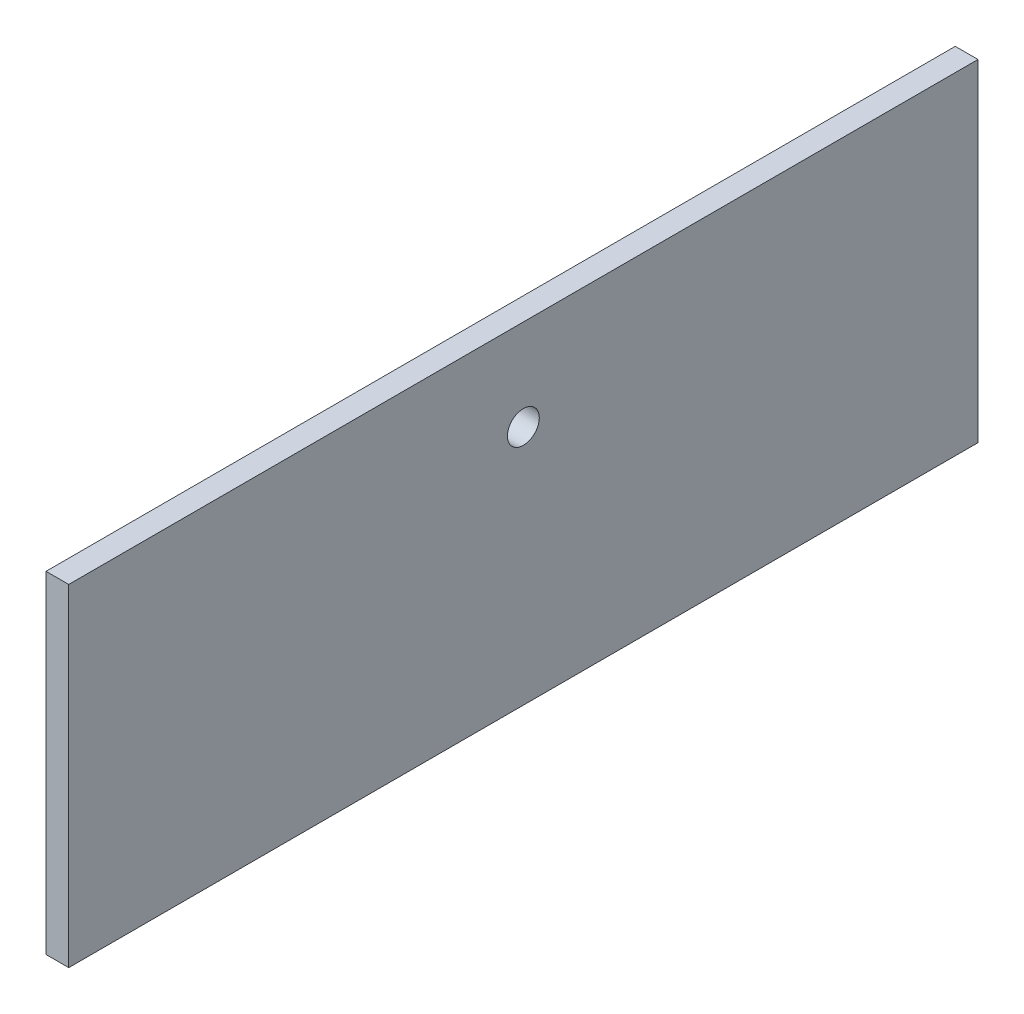
ISO-10303-21;
HEADER;
FILE_DESCRIPTION(('STEP AP214'),'2;1');
FILE_NAME('part.step','',(''),(''),'','','');
FILE_SCHEMA(('AUTOMOTIVE_DESIGN { 1 0 10303 214 1 1 1 1 }'));
ENDSEC;
DATA;
#1=APPLICATION_CONTEXT('core data for automotive mechanical design processes');
#2=APPLICATION_PROTOCOL_DEFINITION('international standard','automotive_design',2000,#1);
#3=PRODUCT_CONTEXT('',#1,'mechanical');
#4=PRODUCT('Part','Part','',(#3));
#5=PRODUCT_RELATED_PRODUCT_CATEGORY('part','',(#4));
#6=PRODUCT_DEFINITION_FORMATION('','',#4);
#7=PRODUCT_DEFINITION_CONTEXT('part definition',#1,'design');
#8=PRODUCT_DEFINITION('design','',#6,#7);
#9=PRODUCT_DEFINITION_SHAPE('','',#8);
#10=(LENGTH_UNIT() NAMED_UNIT(*) SI_UNIT(.MILLI.,.METRE.));
#11=(NAMED_UNIT(*) PLANE_ANGLE_UNIT() SI_UNIT($,.RADIAN.));
#12=(NAMED_UNIT(*) SI_UNIT($,.STERADIAN.) SOLID_ANGLE_UNIT());
#13=UNCERTAINTY_MEASURE_WITH_UNIT(LENGTH_MEASURE(1.E-05),#10,'distance_accuracy_value','');
#14=(GEOMETRIC_REPRESENTATION_CONTEXT(3) GLOBAL_UNCERTAINTY_ASSIGNED_CONTEXT((#13)) GLOBAL_UNIT_ASSIGNED_CONTEXT((#10,
#11,#12)) REPRESENTATION_CONTEXT('',''));
#15=CARTESIAN_POINT('',(0.,0.,0.));
#16=DIRECTION('',(0.,0.,1.));
#17=DIRECTION('',(1.,0.,0.));
#18=AXIS2_PLACEMENT_3D('',#15,#16,#17);
#19=CARTESIAN_POINT('',(-75.,100.,-100.));
#20=DIRECTION('',(0.,0.,1.));
#21=DIRECTION('',(1.,0.,0.));
#22=AXIS2_PLACEMENT_3D('',#19,#20,#21);
#23=PLANE('',#22);
#24=DIRECTION('',(1.,0.,0.));
#25=VECTOR('',#24,1.);
#26=CARTESIAN_POINT('',(-89.8408867904952,22.,-100.));
#27=LINE('',#26,#25);
#28=CARTESIAN_POINT('',(70.,22.,-100.));
#29=VERTEX_POINT('',#28);
#30=CARTESIAN_POINT('',(75.,22.,-100.));
#31=VERTEX_POINT('',#30);
#32=EDGE_CURVE('E101',#29,#31,#27,.T.);
#33=ORIENTED_EDGE('',*,*,#32,.F.);
#34=DIRECTION('',(0.,-1.,0.));
#35=VECTOR('',#34,1.);
#36=CARTESIAN_POINT('',(70.,100.,-100.));
#37=LINE('',#36,#35);
#38=CARTESIAN_POINT('',(70.,95.,-100.));
#39=VERTEX_POINT('',#38);
#40=EDGE_CURVE('E132',#39,#29,#37,.T.);
#41=ORIENTED_EDGE('',*,*,#40,.F.);
#42=DIRECTION('',(1.,0.,0.));
#43=VECTOR('',#42,1.);
#44=CARTESIAN_POINT('',(-89.8408867904952,95.,-100.));
#45=LINE('',#44,#43);
#46=CARTESIAN_POINT('',(75.,95.,-100.));
#47=VERTEX_POINT('',#46);
#48=EDGE_CURVE('E139',#39,#47,#45,.T.);
#49=ORIENTED_EDGE('',*,*,#48,.T.);
#50=DIRECTION('',(0.,-1.,0.));
#51=VECTOR('',#50,1.);
#52=CARTESIAN_POINT('',(75.,100.,-100.));
#53=LINE('',#52,#51);
#54=EDGE_CURVE('E152',#47,#31,#53,.T.);
#55=ORIENTED_EDGE('',*,*,#54,.T.);
#56=EDGE_LOOP('',(#33,#41,#49,#55));
#57=FACE_BOUND('',#56,.T.);
#58=ADVANCED_FACE('F83',(#57),#23,.F.);
#59=CARTESIAN_POINT('',(70.,100.,-100.));
#60=DIRECTION('',(-1.,0.,0.));
#61=DIRECTION('',(0.,0.,1.));
#62=AXIS2_PLACEMENT_3D('',#59,#60,#61);
#63=PLANE('',#62);
#64=CARTESIAN_POINT('',(70.,75.,0.));
#65=DIRECTION('',(-1.,0.,0.));
#66=DIRECTION('',(0.,0.,1.));
#67=AXIS2_PLACEMENT_3D('',#64,#65,#66);
#68=CIRCLE('',#67,3.5);
#69=CARTESIAN_POINT('',(70.,75.,3.5));
#70=VERTEX_POINT('',#69);
#71=EDGE_CURVE('E133',#70,#70,#68,.T.);
#72=ORIENTED_EDGE('',*,*,#71,.F.);
#73=EDGE_LOOP('',(#72));
#74=FACE_BOUND('',#73,.T.);
#75=ORIENTED_EDGE('',*,*,#40,.T.);
#76=DIRECTION('',(0.,0.,-1.));
#77=VECTOR('',#76,1.);
#78=CARTESIAN_POINT('',(70.,22.,-100.));
#79=LINE('',#78,#77);
#80=CARTESIAN_POINT('',(70.,22.,100.));
#81=VERTEX_POINT('',#80);
#82=EDGE_CURVE('E159',#81,#29,#79,.T.);
#83=ORIENTED_EDGE('',*,*,#82,.F.);
#84=DIRECTION('',(0.,-1.,0.));
#85=VECTOR('',#84,1.);
#86=CARTESIAN_POINT('',(70.,100.,100.));
#87=LINE('',#86,#85);
#88=CARTESIAN_POINT('',(70.,95.,100.));
#89=VERTEX_POINT('',#88);
#90=EDGE_CURVE('E134',#89,#81,#87,.T.);
#91=ORIENTED_EDGE('',*,*,#90,.F.);
#92=DIRECTION('',(0.,0.,-1.));
#93=VECTOR('',#92,1.);
#94=CARTESIAN_POINT('',(70.,95.,-100.));
#95=LINE('',#94,#93);
#96=EDGE_CURVE('E126',#89,#39,#95,.T.);
#97=ORIENTED_EDGE('',*,*,#96,.T.);
#98=EDGE_LOOP('',(#75,#83,#91,#97));
#99=FACE_BOUND('',#98,.T.);
#100=ADVANCED_FACE('F127',(#74,#99),#63,.T.);
#101=CARTESIAN_POINT('',(75.,100.,-100.));
#102=DIRECTION('',(-1.,0.,0.));
#103=DIRECTION('',(0.,0.,1.));
#104=AXIS2_PLACEMENT_3D('',#101,#102,#103);
#105=PLANE('',#104);
#106=CARTESIAN_POINT('',(75.,75.,0.));
#107=DIRECTION('',(1.,0.,0.));
#108=DIRECTION('',(0.,0.,-1.));
#109=AXIS2_PLACEMENT_3D('',#106,#107,#108);
#110=CIRCLE('',#109,3.5);
#111=CARTESIAN_POINT('',(75.,75.,-3.50000000000002));
#112=VERTEX_POINT('',#111);
#113=EDGE_CURVE('E144',#112,#112,#110,.T.);
#114=ORIENTED_EDGE('',*,*,#113,.F.);
#115=EDGE_LOOP('',(#114));
#116=FACE_BOUND('',#115,.T.);
#117=ORIENTED_EDGE('',*,*,#54,.F.);
#118=DIRECTION('',(0.,0.,1.));
#119=VECTOR('',#118,1.);
#120=CARTESIAN_POINT('',(75.,95.,-100.));
#121=LINE('',#120,#119);
#122=CARTESIAN_POINT('',(75.,95.,100.));
#123=VERTEX_POINT('',#122);
#124=EDGE_CURVE('E12',#47,#123,#121,.T.);
#125=ORIENTED_EDGE('',*,*,#124,.T.);
#126=DIRECTION('',(0.,-1.,0.));
#127=VECTOR('',#126,1.);
#128=CARTESIAN_POINT('',(75.,100.,100.));
#129=LINE('',#128,#127);
#130=CARTESIAN_POINT('',(75.,22.,100.));
#131=VERTEX_POINT('',#130);
#132=EDGE_CURVE('E150',#123,#131,#129,.T.);
#133=ORIENTED_EDGE('',*,*,#132,.T.);
#134=DIRECTION('',(0.,0.,1.));
#135=VECTOR('',#134,1.);
#136=CARTESIAN_POINT('',(75.,22.,-100.));
#137=LINE('',#136,#135);
#138=EDGE_CURVE('E94',#31,#131,#137,.T.);
#139=ORIENTED_EDGE('',*,*,#138,.F.);
#140=EDGE_LOOP('',(#117,#125,#133,#139));
#141=FACE_BOUND('',#140,.T.);
#142=ADVANCED_FACE('F90',(#116,#141),#105,.F.);
#143=CARTESIAN_POINT('',(-75.,100.,100.));
#144=DIRECTION('',(0.,0.,-1.));
#145=DIRECTION('',(-1.,0.,0.));
#146=AXIS2_PLACEMENT_3D('',#143,#144,#145);
#147=PLANE('',#146);
#148=ORIENTED_EDGE('',*,*,#90,.T.);
#149=DIRECTION('',(1.,0.,0.));
#150=VECTOR('',#149,1.);
#151=CARTESIAN_POINT('',(-89.8408867904952,22.,100.));
#152=LINE('',#151,#150);
#153=EDGE_CURVE('E161',#81,#131,#152,.T.);
#154=ORIENTED_EDGE('',*,*,#153,.T.);
#155=ORIENTED_EDGE('',*,*,#132,.F.);
#156=DIRECTION('',(1.,0.,0.));
#157=VECTOR('',#156,1.);
#158=CARTESIAN_POINT('',(-89.8408867904952,95.,100.));
#159=LINE('',#158,#157);
#160=EDGE_CURVE('E110',#89,#123,#159,.T.);
#161=ORIENTED_EDGE('',*,*,#160,.F.);
#162=EDGE_LOOP('',(#148,#154,#155,#161));
#163=FACE_BOUND('',#162,.T.);
#164=ADVANCED_FACE('F168',(#163),#147,.F.);
#165=CARTESIAN_POINT('',(15.,75.,0.));
#166=DIRECTION('',(1.,0.,0.));
#167=DIRECTION('',(0.,0.,-1.));
#168=AXIS2_PLACEMENT_3D('',#165,#166,#167);
#169=CYLINDRICAL_SURFACE('',#168,3.5);
#170=ORIENTED_EDGE('',*,*,#71,.T.);
#171=EDGE_LOOP('',(#170));
#172=FACE_BOUND('',#171,.T.);
#173=ORIENTED_EDGE('',*,*,#113,.T.);
#174=EDGE_LOOP('',(#173));
#175=FACE_BOUND('',#174,.T.);
#176=ADVANCED_FACE('F177',(#172,#175),#169,.F.);
#177=CARTESIAN_POINT('',(-89.8408867904952,22.,-100.));
#178=DIRECTION('',(0.,-1.,0.));
#179=DIRECTION('',(0.,0.,-1.));
#180=AXIS2_PLACEMENT_3D('',#177,#178,#179);
#181=PLANE('',#180);
#182=ORIENTED_EDGE('',*,*,#138,.T.);
#183=ORIENTED_EDGE('',*,*,#153,.F.);
#184=ORIENTED_EDGE('',*,*,#82,.T.);
#185=ORIENTED_EDGE('',*,*,#32,.T.);
#186=EDGE_LOOP('',(#182,#183,#184,#185));
#187=FACE_BOUND('',#186,.T.);
#188=ADVANCED_FACE('F164',(#187),#181,.T.);
#189=CARTESIAN_POINT('',(-89.8408867904952,95.,-100.));
#190=DIRECTION('',(0.,-1.,0.));
#191=DIRECTION('',(0.,0.,-1.));
#192=AXIS2_PLACEMENT_3D('',#189,#190,#191);
#193=PLANE('',#192);
#194=ORIENTED_EDGE('',*,*,#48,.F.);
#195=ORIENTED_EDGE('',*,*,#96,.F.);
#196=ORIENTED_EDGE('',*,*,#160,.T.);
#197=ORIENTED_EDGE('',*,*,#124,.F.);
#198=EDGE_LOOP('',(#194,#195,#196,#197));
#199=FACE_BOUND('',#198,.T.);
#200=ADVANCED_FACE('F136',(#199),#193,.F.);
#201=CLOSED_SHELL('',(#58,#100,#142,#164,#176,#188,#200));
#202=MANIFOLD_SOLID_BREP('B2',#201);
#203=ADVANCED_BREP_SHAPE_REPRESENTATION('',(#18,#202),#14);
#204=SHAPE_DEFINITION_REPRESENTATION(#9,#203);
ENDSEC;
END-ISO-10303-21;
